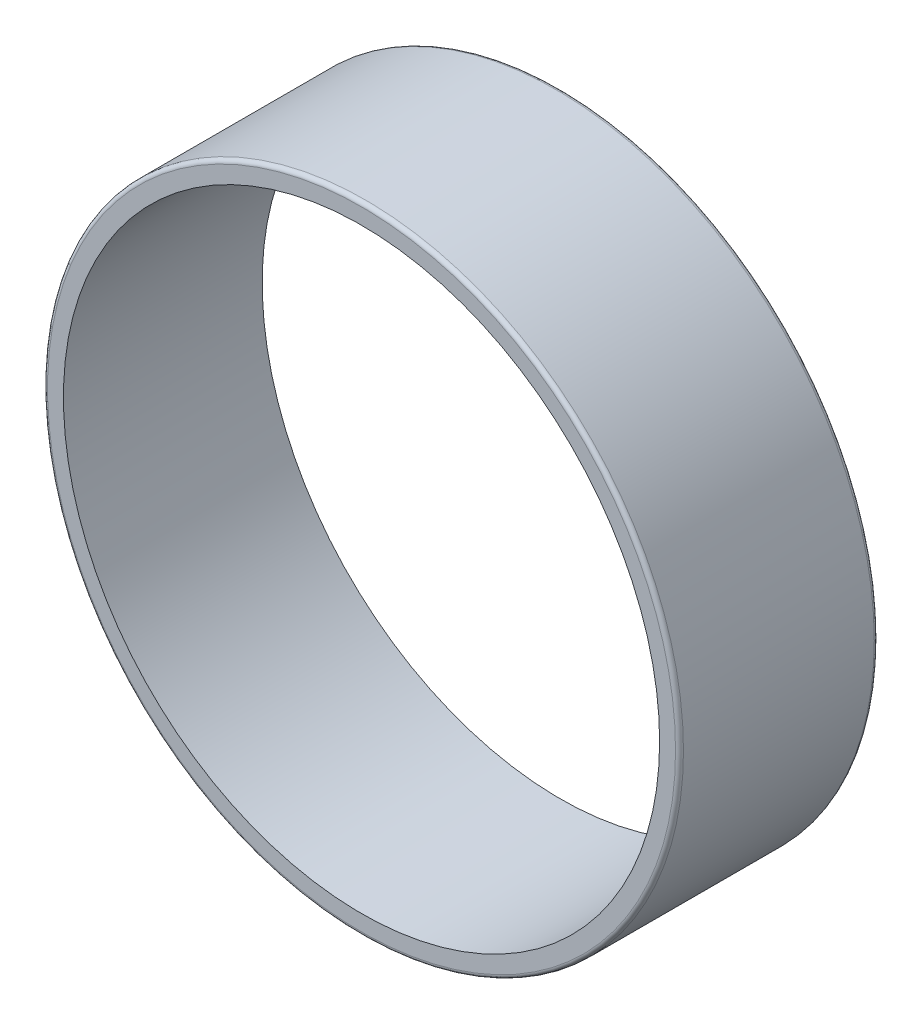
ISO-10303-21;
HEADER;
FILE_DESCRIPTION(('STEP AP214'),'2;1');
FILE_NAME('part.step','',(''),(''),'','','');
FILE_SCHEMA(('AUTOMOTIVE_DESIGN { 1 0 10303 214 1 1 1 1 }'));
ENDSEC;
DATA;
#1=APPLICATION_CONTEXT('core data for automotive mechanical design processes');
#2=APPLICATION_PROTOCOL_DEFINITION('international standard','automotive_design',2000,#1);
#3=PRODUCT_CONTEXT('',#1,'mechanical');
#4=PRODUCT('Part','Part','',(#3));
#5=PRODUCT_RELATED_PRODUCT_CATEGORY('part','',(#4));
#6=PRODUCT_DEFINITION_FORMATION('','',#4);
#7=PRODUCT_DEFINITION_CONTEXT('part definition',#1,'design');
#8=PRODUCT_DEFINITION('design','',#6,#7);
#9=PRODUCT_DEFINITION_SHAPE('','',#8);
#10=(LENGTH_UNIT() NAMED_UNIT(*) SI_UNIT(.MILLI.,.METRE.));
#11=(NAMED_UNIT(*) PLANE_ANGLE_UNIT() SI_UNIT($,.RADIAN.));
#12=(NAMED_UNIT(*) SI_UNIT($,.STERADIAN.) SOLID_ANGLE_UNIT());
#13=UNCERTAINTY_MEASURE_WITH_UNIT(LENGTH_MEASURE(1.E-05),#10,'distance_accuracy_value','');
#14=(GEOMETRIC_REPRESENTATION_CONTEXT(3) GLOBAL_UNCERTAINTY_ASSIGNED_CONTEXT((#13)) GLOBAL_UNIT_ASSIGNED_CONTEXT((#10,
#11,#12)) REPRESENTATION_CONTEXT('',''));
#15=CARTESIAN_POINT('',(0.,0.,0.));
#16=DIRECTION('',(0.,0.,1.));
#17=DIRECTION('',(1.,0.,0.));
#18=AXIS2_PLACEMENT_3D('',#15,#16,#17);
#19=CARTESIAN_POINT('',(0.,0.,5.));
#20=DIRECTION('',(0.,0.,1.));
#21=DIRECTION('',(1.,0.,0.));
#22=AXIS2_PLACEMENT_3D('',#19,#20,#21);
#23=PLANE('',#22);
#24=CARTESIAN_POINT('',(0.,0.,5.));
#25=DIRECTION('',(0.,0.,1.));
#26=DIRECTION('',(1.,0.,0.));
#27=AXIS2_PLACEMENT_3D('',#24,#25,#26);
#28=CIRCLE('',#27,7.9);
#29=CARTESIAN_POINT('',(7.9,0.,5.));
#30=VERTEX_POINT('',#29);
#31=EDGE_CURVE('E10',#30,#30,#28,.T.);
#32=ORIENTED_EDGE('',*,*,#31,.T.);
#33=EDGE_LOOP('',(#32));
#34=FACE_BOUND('',#33,.T.);
#35=CARTESIAN_POINT('',(0.,0.,5.));
#36=DIRECTION('',(0.,0.,1.));
#37=DIRECTION('',(1.,0.,0.));
#38=AXIS2_PLACEMENT_3D('',#35,#36,#37);
#39=CIRCLE('',#38,7.5);
#40=CARTESIAN_POINT('',(7.5,0.,5.));
#41=VERTEX_POINT('',#40);
#42=EDGE_CURVE('E64',#41,#41,#39,.T.);
#43=ORIENTED_EDGE('',*,*,#42,.F.);
#44=EDGE_LOOP('',(#43));
#45=FACE_BOUND('',#44,.T.);
#46=ADVANCED_FACE('F38',(#34,#45),#23,.T.);
#47=CARTESIAN_POINT('',(0.,0.,0.));
#48=DIRECTION('',(0.,0.,1.));
#49=DIRECTION('',(1.,0.,0.));
#50=AXIS2_PLACEMENT_3D('',#47,#48,#49);
#51=PLANE('',#50);
#52=CARTESIAN_POINT('',(0.,0.,0.));
#53=DIRECTION('',(0.,0.,1.));
#54=DIRECTION('',(1.,0.,0.));
#55=AXIS2_PLACEMENT_3D('',#52,#53,#54);
#56=CIRCLE('',#55,7.9);
#57=CARTESIAN_POINT('',(7.9,0.,0.));
#58=VERTEX_POINT('',#57);
#59=EDGE_CURVE('E46',#58,#58,#56,.F.);
#60=ORIENTED_EDGE('',*,*,#59,.T.);
#61=EDGE_LOOP('',(#60));
#62=FACE_BOUND('',#61,.T.);
#63=CARTESIAN_POINT('',(0.,0.,0.));
#64=DIRECTION('',(0.,0.,1.));
#65=DIRECTION('',(1.,0.,0.));
#66=AXIS2_PLACEMENT_3D('',#63,#64,#65);
#67=CIRCLE('',#66,7.5);
#68=CARTESIAN_POINT('',(7.5,0.,0.));
#69=VERTEX_POINT('',#68);
#70=EDGE_CURVE('E65',#69,#69,#67,.T.);
#71=ORIENTED_EDGE('',*,*,#70,.T.);
#72=EDGE_LOOP('',(#71));
#73=FACE_BOUND('',#72,.T.);
#74=ADVANCED_FACE('F76',(#62,#73),#51,.F.);
#75=CARTESIAN_POINT('',(0.,0.,5.));
#76=DIRECTION('',(0.,0.,-1.));
#77=DIRECTION('',(-1.,0.,0.));
#78=AXIS2_PLACEMENT_3D('',#75,#76,#77);
#79=CYLINDRICAL_SURFACE('',#78,8.);
#80=CARTESIAN_POINT('',(0.,0.,0.1));
#81=DIRECTION('',(0.,0.,1.));
#82=DIRECTION('',(1.,0.,0.));
#83=AXIS2_PLACEMENT_3D('',#80,#81,#82);
#84=CIRCLE('',#83,8.);
#85=CARTESIAN_POINT('',(8.,0.,0.1));
#86=VERTEX_POINT('',#85);
#87=EDGE_CURVE('E52',#86,#86,#84,.T.);
#88=ORIENTED_EDGE('',*,*,#87,.T.);
#89=EDGE_LOOP('',(#88));
#90=FACE_BOUND('',#89,.T.);
#91=CARTESIAN_POINT('',(0.,0.,4.9));
#92=DIRECTION('',(0.,0.,1.));
#93=DIRECTION('',(1.,0.,0.));
#94=AXIS2_PLACEMENT_3D('',#91,#92,#93);
#95=CIRCLE('',#94,8.);
#96=CARTESIAN_POINT('',(8.,0.,4.9));
#97=VERTEX_POINT('',#96);
#98=EDGE_CURVE('E59',#97,#97,#95,.F.);
#99=ORIENTED_EDGE('',*,*,#98,.T.);
#100=EDGE_LOOP('',(#99));
#101=FACE_BOUND('',#100,.T.);
#102=ADVANCED_FACE('F81',(#90,#101),#79,.T.);
#103=CARTESIAN_POINT('',(0.,0.,5.));
#104=DIRECTION('',(0.,0.,-1.));
#105=DIRECTION('',(-1.,0.,0.));
#106=AXIS2_PLACEMENT_3D('',#103,#104,#105);
#107=CYLINDRICAL_SURFACE('',#106,7.5);
#108=ORIENTED_EDGE('',*,*,#42,.T.);
#109=EDGE_LOOP('',(#108));
#110=FACE_BOUND('',#109,.T.);
#111=ORIENTED_EDGE('',*,*,#70,.F.);
#112=EDGE_LOOP('',(#111));
#113=FACE_BOUND('',#112,.T.);
#114=ADVANCED_FACE('F72',(#110,#113),#107,.F.);
#115=CARTESIAN_POINT('',(0.,0.,0.1));
#116=DIRECTION('',(0.,0.,1.));
#117=DIRECTION('',(1.,0.,0.));
#118=AXIS2_PLACEMENT_3D('',#115,#116,#117);
#119=TOROIDAL_SURFACE('',#118,7.9,0.1);
#120=ORIENTED_EDGE('',*,*,#59,.F.);
#121=EDGE_LOOP('',(#120));
#122=FACE_BOUND('',#121,.T.);
#123=ORIENTED_EDGE('',*,*,#87,.F.);
#124=EDGE_LOOP('',(#123));
#125=FACE_BOUND('',#124,.T.);
#126=ADVANCED_FACE('F87',(#122,#125),#119,.T.);
#127=CARTESIAN_POINT('',(0.,0.,4.9));
#128=DIRECTION('',(0.,0.,1.));
#129=DIRECTION('',(1.,0.,0.));
#130=AXIS2_PLACEMENT_3D('',#127,#128,#129);
#131=TOROIDAL_SURFACE('',#130,7.9,0.1);
#132=ORIENTED_EDGE('',*,*,#98,.F.);
#133=EDGE_LOOP('',(#132));
#134=FACE_BOUND('',#133,.T.);
#135=ORIENTED_EDGE('',*,*,#31,.F.);
#136=EDGE_LOOP('',(#135));
#137=FACE_BOUND('',#136,.T.);
#138=ADVANCED_FACE('F40',(#134,#137),#131,.T.);
#139=CLOSED_SHELL('',(#46,#74,#102,#114,#126,#138));
#140=MANIFOLD_SOLID_BREP('B2',#139);
#141=ADVANCED_BREP_SHAPE_REPRESENTATION('',(#18,#140),#14);
#142=SHAPE_DEFINITION_REPRESENTATION(#9,#141);
ENDSEC;
END-ISO-10303-21;
